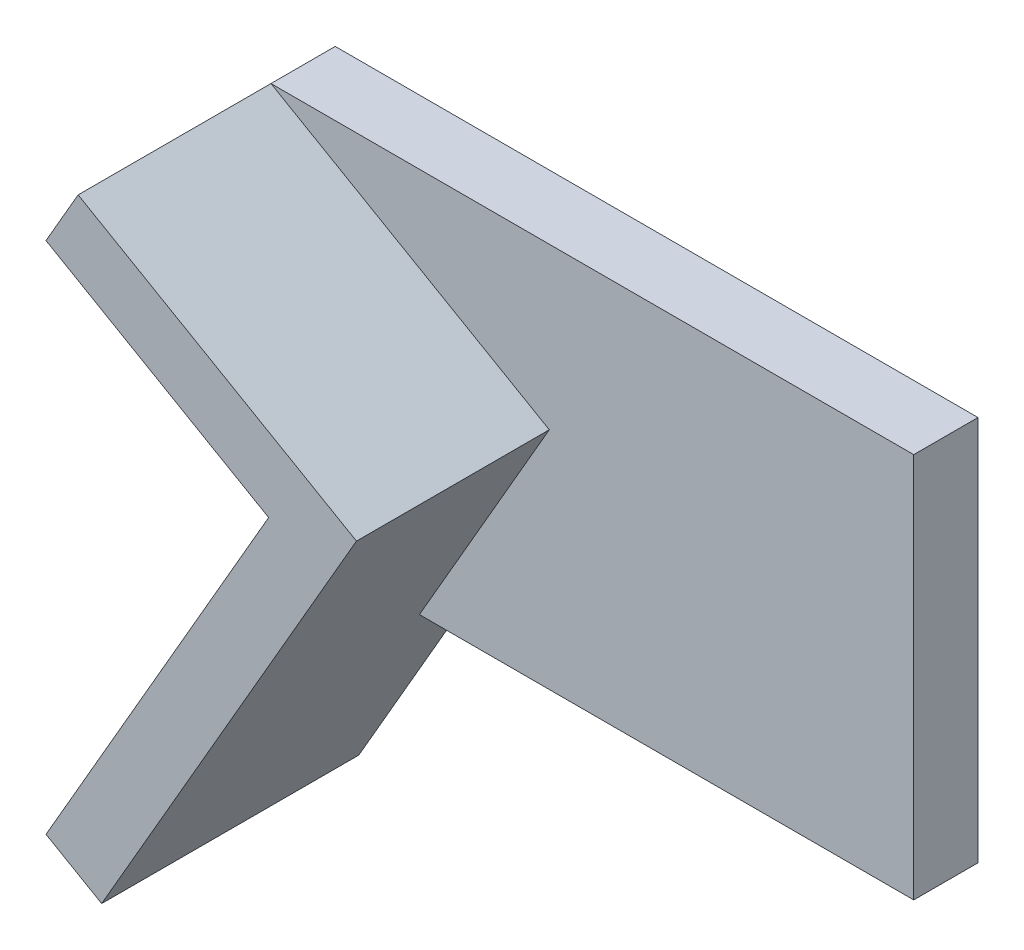
ISO-10303-21;
HEADER;
FILE_DESCRIPTION(('STEP AP214'),'2;1');
FILE_NAME('part.step','',(''),(''),'','','');
FILE_SCHEMA(('AUTOMOTIVE_DESIGN { 1 0 10303 214 1 1 1 1 }'));
ENDSEC;
DATA;
#1=APPLICATION_CONTEXT('core data for automotive mechanical design processes');
#2=APPLICATION_PROTOCOL_DEFINITION('international standard','automotive_design',2000,#1);
#3=PRODUCT_CONTEXT('',#1,'mechanical');
#4=PRODUCT('Part','Part','',(#3));
#5=PRODUCT_RELATED_PRODUCT_CATEGORY('part','',(#4));
#6=PRODUCT_DEFINITION_FORMATION('','',#4);
#7=PRODUCT_DEFINITION_CONTEXT('part definition',#1,'design');
#8=PRODUCT_DEFINITION('design','',#6,#7);
#9=PRODUCT_DEFINITION_SHAPE('','',#8);
#10=(LENGTH_UNIT() NAMED_UNIT(*) SI_UNIT(.MILLI.,.METRE.));
#11=(NAMED_UNIT(*) PLANE_ANGLE_UNIT() SI_UNIT($,.RADIAN.));
#12=(NAMED_UNIT(*) SI_UNIT($,.STERADIAN.) SOLID_ANGLE_UNIT());
#13=UNCERTAINTY_MEASURE_WITH_UNIT(LENGTH_MEASURE(1.E-05),#10,'distance_accuracy_value','');
#14=(GEOMETRIC_REPRESENTATION_CONTEXT(3) GLOBAL_UNCERTAINTY_ASSIGNED_CONTEXT((#13)) GLOBAL_UNIT_ASSIGNED_CONTEXT((#10,
#11,#12)) REPRESENTATION_CONTEXT('',''));
#15=CARTESIAN_POINT('',(0.,0.,0.));
#16=DIRECTION('',(0.,0.,1.));
#17=DIRECTION('',(1.,0.,0.));
#18=AXIS2_PLACEMENT_3D('',#15,#16,#17);
#19=CARTESIAN_POINT('',(4.83012701892219,6.36602540378436,4.));
#20=DIRECTION('',(-0.500000000000004,-0.866025403784436,0.));
#21=DIRECTION('',(0.866025403784436,-0.500000000000004,0.));
#22=AXIS2_PLACEMENT_3D('',#19,#20,#21);
#23=PLANE('',#22);
#24=DIRECTION('',(-0.866025403784439,0.5,0.));
#25=VECTOR('',#24,1.);
#26=CARTESIAN_POINT('',(4.83012701892219,6.36602540378436,1.));
#27=LINE('',#26,#25);
#28=CARTESIAN_POINT('',(4.83012701892219,6.36602540378436,1.));
#29=VERTEX_POINT('',#28);
#30=CARTESIAN_POINT('',(0.500000000000005,8.86602540378438,1.));
#31=VERTEX_POINT('',#30);
#32=EDGE_CURVE('E130',#29,#31,#27,.T.);
#33=ORIENTED_EDGE('',*,*,#32,.T.);
#34=DIRECTION('',(0.,0.,-1.));
#35=VECTOR('',#34,1.);
#36=CARTESIAN_POINT('',(0.500000000000005,8.86602540378438,4.));
#37=LINE('',#36,#35);
#38=CARTESIAN_POINT('',(0.500000000000005,8.86602540378438,4.));
#39=VERTEX_POINT('',#38);
#40=EDGE_CURVE('E178',#39,#31,#37,.T.);
#41=ORIENTED_EDGE('',*,*,#40,.F.);
#42=DIRECTION('',(-0.866025403784436,0.500000000000004,0.));
#43=VECTOR('',#42,1.);
#44=CARTESIAN_POINT('',(4.83012701892219,6.36602540378436,4.));
#45=LINE('',#44,#43);
#46=CARTESIAN_POINT('',(4.83012701892219,6.36602540378436,4.));
#47=VERTEX_POINT('',#46);
#48=EDGE_CURVE('E152',#47,#39,#45,.T.);
#49=ORIENTED_EDGE('',*,*,#48,.F.);
#50=DIRECTION('',(0.,0.,-1.));
#51=VECTOR('',#50,1.);
#52=CARTESIAN_POINT('',(4.83012701892219,6.36602540378436,4.));
#53=LINE('',#52,#51);
#54=EDGE_CURVE('E41',#47,#29,#53,.T.);
#55=ORIENTED_EDGE('',*,*,#54,.T.);
#56=EDGE_LOOP('',(#33,#41,#49,#55));
#57=FACE_BOUND('',#56,.T.);
#58=ADVANCED_FACE('F33',(#57),#23,.F.);
#59=CARTESIAN_POINT('',(0.,0.,4.));
#60=DIRECTION('',(0.500000000000004,0.866025403784436,0.));
#61=DIRECTION('',(-0.866025403784436,0.500000000000004,0.));
#62=AXIS2_PLACEMENT_3D('',#59,#60,#61);
#63=PLANE('',#62);
#64=DIRECTION('',(0.866025403784436,-0.500000000000004,0.));
#65=VECTOR('',#64,1.);
#66=CARTESIAN_POINT('',(0.,0.,0.));
#67=LINE('',#66,#65);
#68=CARTESIAN_POINT('',(0.,0.,0.));
#69=VERTEX_POINT('',#68);
#70=CARTESIAN_POINT('',(0.866025403784436,-0.500000000000004,0.));
#71=VERTEX_POINT('',#70);
#72=EDGE_CURVE('E143',#69,#71,#67,.T.);
#73=ORIENTED_EDGE('',*,*,#72,.T.);
#74=DIRECTION('',(0.,0.,-1.));
#75=VECTOR('',#74,1.);
#76=CARTESIAN_POINT('',(0.866025403784436,-0.500000000000004,4.));
#77=LINE('',#76,#75);
#78=CARTESIAN_POINT('',(0.866025403784436,-0.500000000000004,4.));
#79=VERTEX_POINT('',#78);
#80=EDGE_CURVE('E11',#79,#71,#77,.T.);
#81=ORIENTED_EDGE('',*,*,#80,.F.);
#82=DIRECTION('',(0.866025403784436,-0.500000000000004,0.));
#83=VECTOR('',#82,1.);
#84=CARTESIAN_POINT('',(0.,0.,4.));
#85=LINE('',#84,#83);
#86=CARTESIAN_POINT('',(0.,0.,4.));
#87=VERTEX_POINT('',#86);
#88=EDGE_CURVE('E146',#87,#79,#85,.T.);
#89=ORIENTED_EDGE('',*,*,#88,.F.);
#90=DIRECTION('',(0.,0.,-1.));
#91=VECTOR('',#90,1.);
#92=CARTESIAN_POINT('',(0.,0.,4.));
#93=LINE('',#92,#91);
#94=EDGE_CURVE('E160',#87,#69,#93,.T.);
#95=ORIENTED_EDGE('',*,*,#94,.T.);
#96=EDGE_LOOP('',(#73,#81,#89,#95));
#97=FACE_BOUND('',#96,.T.);
#98=ADVANCED_FACE('F35',(#97),#63,.F.);
#99=CARTESIAN_POINT('',(0.866025403784436,-0.500000000000004,4.));
#100=DIRECTION('',(-0.866025403784436,0.500000000000004,0.));
#101=DIRECTION('',(-0.500000000000004,-0.866025403784436,0.));
#102=AXIS2_PLACEMENT_3D('',#99,#100,#101);
#103=PLANE('',#102);
#104=DIRECTION('',(0.500000000000004,0.866025403784436,0.));
#105=VECTOR('',#104,1.);
#106=CARTESIAN_POINT('',(0.866025403784436,-0.500000000000004,0.));
#107=LINE('',#106,#105);
#108=CARTESIAN_POINT('',(2.80940107675847,2.86602540378435,0.));
#109=VERTEX_POINT('',#108);
#110=EDGE_CURVE('E163',#71,#109,#107,.T.);
#111=ORIENTED_EDGE('',*,*,#110,.T.);
#112=DIRECTION('',(0.,0.,-1.));
#113=VECTOR('',#112,1.);
#114=CARTESIAN_POINT('',(2.80940107675846,2.86602540378435,1.));
#115=LINE('',#114,#113);
#116=CARTESIAN_POINT('',(2.80940107675847,2.86602540378435,1.));
#117=VERTEX_POINT('',#116);
#118=EDGE_CURVE('E48',#117,#109,#115,.T.);
#119=ORIENTED_EDGE('',*,*,#118,.F.);
#120=DIRECTION('',(0.500000000000007,0.866025403784434,0.));
#121=VECTOR('',#120,1.);
#122=CARTESIAN_POINT('',(2.80940107675846,2.86602540378435,1.));
#123=LINE('',#122,#121);
#124=EDGE_CURVE('E53',#117,#29,#123,.T.);
#125=ORIENTED_EDGE('',*,*,#124,.T.);
#126=ORIENTED_EDGE('',*,*,#54,.F.);
#127=DIRECTION('',(0.500000000000004,0.866025403784436,0.));
#128=VECTOR('',#127,1.);
#129=CARTESIAN_POINT('',(0.866025403784436,-0.500000000000004,4.));
#130=LINE('',#129,#128);
#131=EDGE_CURVE('E149',#79,#47,#130,.T.);
#132=ORIENTED_EDGE('',*,*,#131,.F.);
#133=ORIENTED_EDGE('',*,*,#80,.T.);
#134=EDGE_LOOP('',(#111,#119,#125,#126,#132,#133));
#135=FACE_BOUND('',#134,.T.);
#136=ADVANCED_FACE('F183',(#135),#103,.F.);
#137=CARTESIAN_POINT('',(0.,7.99999999999994,4.));
#138=DIRECTION('',(0.866025403784437,-0.500000000000003,0.));
#139=DIRECTION('',(0.500000000000003,0.866025403784437,0.));
#140=AXIS2_PLACEMENT_3D('',#137,#138,#139);
#141=PLANE('',#140);
#142=DIRECTION('',(-0.500000000000003,-0.866025403784437,0.));
#143=VECTOR('',#142,1.);
#144=CARTESIAN_POINT('',(0.,7.99999999999994,0.));
#145=LINE('',#144,#143);
#146=CARTESIAN_POINT('',(0.500000000000005,8.86602540378438,0.));
#147=VERTEX_POINT('',#146);
#148=CARTESIAN_POINT('',(0.,7.99999999999994,0.));
#149=VERTEX_POINT('',#148);
#150=EDGE_CURVE('E165',#147,#149,#145,.T.);
#151=ORIENTED_EDGE('',*,*,#150,.T.);
#152=DIRECTION('',(0.,0.,-1.));
#153=VECTOR('',#152,1.);
#154=CARTESIAN_POINT('',(0.,7.99999999999994,4.));
#155=LINE('',#154,#153);
#156=CARTESIAN_POINT('',(0.,7.99999999999994,4.));
#157=VERTEX_POINT('',#156);
#158=EDGE_CURVE('E175',#157,#149,#155,.T.);
#159=ORIENTED_EDGE('',*,*,#158,.F.);
#160=DIRECTION('',(-0.500000000000003,-0.866025403784437,0.));
#161=VECTOR('',#160,1.);
#162=CARTESIAN_POINT('',(0.,7.99999999999994,4.));
#163=LINE('',#162,#161);
#164=EDGE_CURVE('E154',#39,#157,#163,.T.);
#165=ORIENTED_EDGE('',*,*,#164,.F.);
#166=ORIENTED_EDGE('',*,*,#40,.T.);
#167=DIRECTION('',(0.,0.,-1.));
#168=VECTOR('',#167,1.);
#169=CARTESIAN_POINT('',(0.499999999999994,8.86602540378436,1.));
#170=LINE('',#169,#168);
#171=EDGE_CURVE('E118',#31,#147,#170,.T.);
#172=ORIENTED_EDGE('',*,*,#171,.T.);
#173=EDGE_LOOP('',(#151,#159,#165,#166,#172));
#174=FACE_BOUND('',#173,.T.);
#175=ADVANCED_FACE('F202',(#174),#141,.F.);
#176=CARTESIAN_POINT('',(3.46410161513775,5.99999999999992,4.));
#177=DIRECTION('',(0.500000000000004,0.866025403784436,0.));
#178=DIRECTION('',(-0.866025403784436,0.500000000000004,0.));
#179=AXIS2_PLACEMENT_3D('',#176,#177,#178);
#180=PLANE('',#179);
#181=DIRECTION('',(0.866025403784436,-0.500000000000004,0.));
#182=VECTOR('',#181,1.);
#183=CARTESIAN_POINT('',(3.46410161513775,5.99999999999992,0.));
#184=LINE('',#183,#182);
#185=CARTESIAN_POINT('',(3.46410161513775,5.99999999999992,0.));
#186=VERTEX_POINT('',#185);
#187=EDGE_CURVE('E167',#149,#186,#184,.T.);
#188=ORIENTED_EDGE('',*,*,#187,.T.);
#189=DIRECTION('',(0.,0.,-1.));
#190=VECTOR('',#189,1.);
#191=CARTESIAN_POINT('',(3.46410161513775,5.99999999999992,4.));
#192=LINE('',#191,#190);
#193=CARTESIAN_POINT('',(3.46410161513775,5.99999999999992,4.));
#194=VERTEX_POINT('',#193);
#195=EDGE_CURVE('E172',#194,#186,#192,.T.);
#196=ORIENTED_EDGE('',*,*,#195,.F.);
#197=DIRECTION('',(0.866025403784436,-0.500000000000004,0.));
#198=VECTOR('',#197,1.);
#199=CARTESIAN_POINT('',(3.46410161513775,5.99999999999992,4.));
#200=LINE('',#199,#198);
#201=EDGE_CURVE('E156',#157,#194,#200,.T.);
#202=ORIENTED_EDGE('',*,*,#201,.F.);
#203=ORIENTED_EDGE('',*,*,#158,.T.);
#204=EDGE_LOOP('',(#188,#196,#202,#203));
#205=FACE_BOUND('',#204,.T.);
#206=ADVANCED_FACE('F206',(#205),#180,.F.);
#207=CARTESIAN_POINT('',(0.,0.,4.));
#208=DIRECTION('',(0.866025403784436,-0.500000000000004,0.));
#209=DIRECTION('',(0.500000000000004,0.866025403784436,0.));
#210=AXIS2_PLACEMENT_3D('',#207,#208,#209);
#211=PLANE('',#210);
#212=DIRECTION('',(-0.500000000000004,-0.866025403784436,0.));
#213=VECTOR('',#212,1.);
#214=CARTESIAN_POINT('',(0.,0.,0.));
#215=LINE('',#214,#213);
#216=EDGE_CURVE('E150',#186,#69,#215,.T.);
#217=ORIENTED_EDGE('',*,*,#216,.T.);
#218=ORIENTED_EDGE('',*,*,#94,.F.);
#219=DIRECTION('',(-0.500000000000004,-0.866025403784436,0.));
#220=VECTOR('',#219,1.);
#221=CARTESIAN_POINT('',(0.,0.,4.));
#222=LINE('',#221,#220);
#223=EDGE_CURVE('E158',#194,#87,#222,.T.);
#224=ORIENTED_EDGE('',*,*,#223,.F.);
#225=ORIENTED_EDGE('',*,*,#195,.T.);
#226=EDGE_LOOP('',(#217,#218,#224,#225));
#227=FACE_BOUND('',#226,.T.);
#228=ADVANCED_FACE('F209',(#227),#211,.F.);
#229=CARTESIAN_POINT('',(0.,0.,4.));
#230=DIRECTION('',(0.,0.,1.));
#231=DIRECTION('',(1.,0.,0.));
#232=AXIS2_PLACEMENT_3D('',#229,#230,#231);
#233=PLANE('',#232);
#234=ORIENTED_EDGE('',*,*,#88,.T.);
#235=ORIENTED_EDGE('',*,*,#131,.T.);
#236=ORIENTED_EDGE('',*,*,#48,.T.);
#237=ORIENTED_EDGE('',*,*,#164,.T.);
#238=ORIENTED_EDGE('',*,*,#201,.T.);
#239=ORIENTED_EDGE('',*,*,#223,.T.);
#240=EDGE_LOOP('',(#234,#235,#236,#237,#238,#239));
#241=FACE_BOUND('',#240,.T.);
#242=ADVANCED_FACE('F187',(#241),#233,.T.);
#243=CARTESIAN_POINT('',(0.,0.,0.));
#244=DIRECTION('',(0.,0.,1.));
#245=DIRECTION('',(1.,0.,0.));
#246=AXIS2_PLACEMENT_3D('',#243,#244,#245);
#247=PLANE('',#246);
#248=ORIENTED_EDGE('',*,*,#150,.F.);
#249=DIRECTION('',(1.,0.,0.));
#250=VECTOR('',#249,1.);
#251=CARTESIAN_POINT('',(0.499999999999994,8.86602540378436,0.));
#252=LINE('',#251,#250);
#253=CARTESIAN_POINT('',(10.5,8.86602540378437,0.));
#254=VERTEX_POINT('',#253);
#255=EDGE_CURVE('E137',#147,#254,#252,.T.);
#256=ORIENTED_EDGE('',*,*,#255,.T.);
#257=DIRECTION('',(0.,-1.,0.));
#258=VECTOR('',#257,1.);
#259=CARTESIAN_POINT('',(10.5,8.86602540378437,0.));
#260=LINE('',#259,#258);
#261=CARTESIAN_POINT('',(10.5,2.86602540378437,0.));
#262=VERTEX_POINT('',#261);
#263=EDGE_CURVE('E112',#254,#262,#260,.T.);
#264=ORIENTED_EDGE('',*,*,#263,.T.);
#265=DIRECTION('',(-1.,0.,0.));
#266=VECTOR('',#265,1.);
#267=CARTESIAN_POINT('',(10.5,2.86602540378437,0.));
#268=LINE('',#267,#266);
#269=EDGE_CURVE('E132',#262,#109,#268,.T.);
#270=ORIENTED_EDGE('',*,*,#269,.T.);
#271=ORIENTED_EDGE('',*,*,#110,.F.);
#272=ORIENTED_EDGE('',*,*,#72,.F.);
#273=ORIENTED_EDGE('',*,*,#216,.F.);
#274=ORIENTED_EDGE('',*,*,#187,.F.);
#275=EDGE_LOOP('',(#248,#256,#264,#270,#271,#272,#273,#274));
#276=FACE_BOUND('',#275,.T.);
#277=ADVANCED_FACE('F195',(#276),#247,.F.);
#278=CARTESIAN_POINT('',(10.5,2.86602540378437,1.));
#279=DIRECTION('',(0.,-1.,0.));
#280=DIRECTION('',(1.,0.,0.));
#281=AXIS2_PLACEMENT_3D('',#278,#279,#280);
#282=PLANE('',#281);
#283=ORIENTED_EDGE('',*,*,#269,.F.);
#284=DIRECTION('',(0.,0.,-1.));
#285=VECTOR('',#284,1.);
#286=CARTESIAN_POINT('',(10.5,2.86602540378437,1.));
#287=LINE('',#286,#285);
#288=CARTESIAN_POINT('',(10.5,2.86602540378437,1.));
#289=VERTEX_POINT('',#288);
#290=EDGE_CURVE('E117',#289,#262,#287,.T.);
#291=ORIENTED_EDGE('',*,*,#290,.F.);
#292=DIRECTION('',(-1.,0.,0.));
#293=VECTOR('',#292,1.);
#294=CARTESIAN_POINT('',(10.5,2.86602540378437,1.));
#295=LINE('',#294,#293);
#296=EDGE_CURVE('E126',#289,#117,#295,.T.);
#297=ORIENTED_EDGE('',*,*,#296,.T.);
#298=ORIENTED_EDGE('',*,*,#118,.T.);
#299=EDGE_LOOP('',(#283,#291,#297,#298));
#300=FACE_BOUND('',#299,.T.);
#301=ADVANCED_FACE('F199',(#300),#282,.T.);
#302=CARTESIAN_POINT('',(10.5,8.86602540378437,1.));
#303=DIRECTION('',(1.,0.,0.));
#304=DIRECTION('',(0.,0.,-1.));
#305=AXIS2_PLACEMENT_3D('',#302,#303,#304);
#306=PLANE('',#305);
#307=ORIENTED_EDGE('',*,*,#263,.F.);
#308=DIRECTION('',(0.,0.,-1.));
#309=VECTOR('',#308,1.);
#310=CARTESIAN_POINT('',(10.5,8.86602540378437,1.));
#311=LINE('',#310,#309);
#312=CARTESIAN_POINT('',(10.5,8.86602540378437,1.));
#313=VERTEX_POINT('',#312);
#314=EDGE_CURVE('E107',#313,#254,#311,.T.);
#315=ORIENTED_EDGE('',*,*,#314,.F.);
#316=DIRECTION('',(0.,-1.,0.));
#317=VECTOR('',#316,1.);
#318=CARTESIAN_POINT('',(10.5,8.86602540378437,1.));
#319=LINE('',#318,#317);
#320=EDGE_CURVE('E110',#313,#289,#319,.T.);
#321=ORIENTED_EDGE('',*,*,#320,.T.);
#322=ORIENTED_EDGE('',*,*,#290,.T.);
#323=EDGE_LOOP('',(#307,#315,#321,#322));
#324=FACE_BOUND('',#323,.T.);
#325=ADVANCED_FACE('F109',(#324),#306,.T.);
#326=CARTESIAN_POINT('',(0.499999999999994,8.86602540378436,1.));
#327=DIRECTION('',(0.,1.,0.));
#328=DIRECTION('',(-1.,0.,0.));
#329=AXIS2_PLACEMENT_3D('',#326,#327,#328);
#330=PLANE('',#329);
#331=ORIENTED_EDGE('',*,*,#255,.F.);
#332=ORIENTED_EDGE('',*,*,#171,.F.);
#333=DIRECTION('',(1.,0.,0.));
#334=VECTOR('',#333,1.);
#335=CARTESIAN_POINT('',(0.499999999999994,8.86602540378436,1.));
#336=LINE('',#335,#334);
#337=EDGE_CURVE('E125',#31,#313,#336,.T.);
#338=ORIENTED_EDGE('',*,*,#337,.T.);
#339=ORIENTED_EDGE('',*,*,#314,.T.);
#340=EDGE_LOOP('',(#331,#332,#338,#339));
#341=FACE_BOUND('',#340,.T.);
#342=ADVANCED_FACE('F129',(#341),#330,.T.);
#343=CARTESIAN_POINT('',(0.,0.,1.));
#344=DIRECTION('',(0.,0.,-1.));
#345=DIRECTION('',(-1.,0.,0.));
#346=AXIS2_PLACEMENT_3D('',#343,#344,#345);
#347=PLANE('',#346);
#348=ORIENTED_EDGE('',*,*,#32,.F.);
#349=ORIENTED_EDGE('',*,*,#124,.F.);
#350=ORIENTED_EDGE('',*,*,#296,.F.);
#351=ORIENTED_EDGE('',*,*,#320,.F.);
#352=ORIENTED_EDGE('',*,*,#337,.F.);
#353=EDGE_LOOP('',(#348,#349,#350,#351,#352));
#354=FACE_BOUND('',#353,.T.);
#355=ADVANCED_FACE('F124',(#354),#347,.F.);
#356=CLOSED_SHELL('',(#58,#98,#136,#175,#206,#228,#242,#277,#301,#325,#342,#355));
#357=MANIFOLD_SOLID_BREP('B2',#356);
#358=ADVANCED_BREP_SHAPE_REPRESENTATION('',(#18,#357),#14);
#359=SHAPE_DEFINITION_REPRESENTATION(#9,#358);
ENDSEC;
END-ISO-10303-21;
